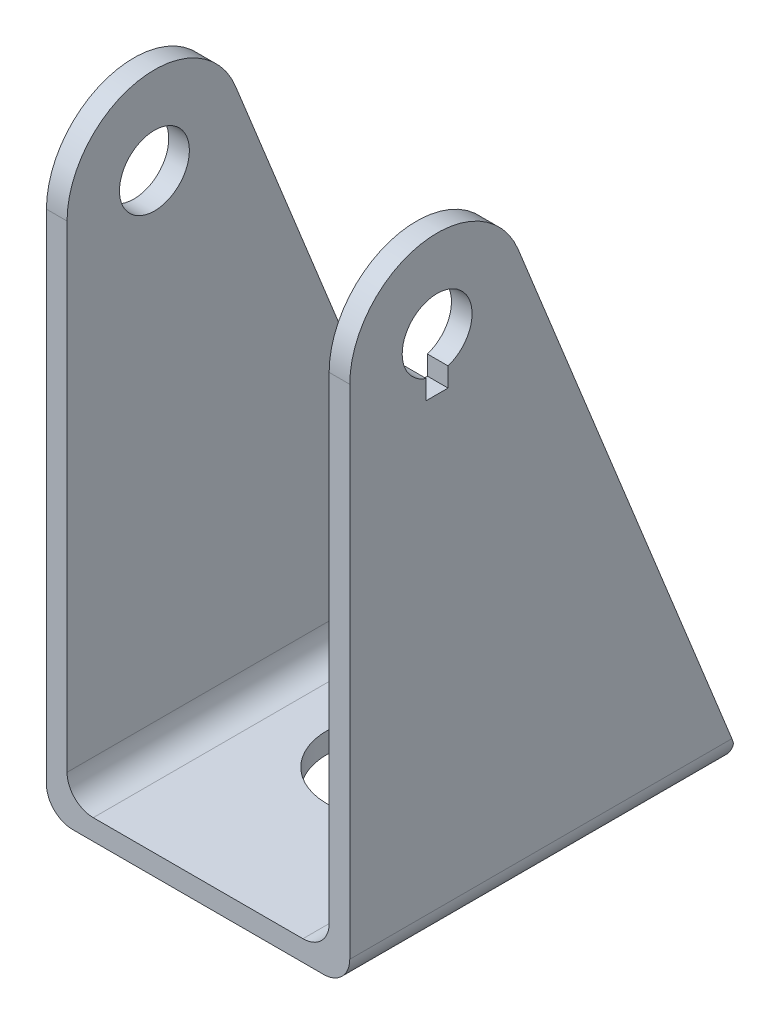
ISO-10303-21;
HEADER;
FILE_DESCRIPTION(('STEP AP214'),'2;1');
FILE_NAME('part.step','',(''),(''),'','','');
FILE_SCHEMA(('AUTOMOTIVE_DESIGN { 1 0 10303 214 1 1 1 1 }'));
ENDSEC;
DATA;
#1=APPLICATION_CONTEXT('core data for automotive mechanical design processes');
#2=APPLICATION_PROTOCOL_DEFINITION('international standard','automotive_design',2000,#1);
#3=PRODUCT_CONTEXT('',#1,'mechanical');
#4=PRODUCT('Part','Part','',(#3));
#5=PRODUCT_RELATED_PRODUCT_CATEGORY('part','',(#4));
#6=PRODUCT_DEFINITION_FORMATION('','',#4);
#7=PRODUCT_DEFINITION_CONTEXT('part definition',#1,'design');
#8=PRODUCT_DEFINITION('design','',#6,#7);
#9=PRODUCT_DEFINITION_SHAPE('','',#8);
#10=(LENGTH_UNIT() NAMED_UNIT(*) SI_UNIT(.MILLI.,.METRE.));
#11=(NAMED_UNIT(*) PLANE_ANGLE_UNIT() SI_UNIT($,.RADIAN.));
#12=(NAMED_UNIT(*) SI_UNIT($,.STERADIAN.) SOLID_ANGLE_UNIT());
#13=UNCERTAINTY_MEASURE_WITH_UNIT(LENGTH_MEASURE(1.E-05),#10,'distance_accuracy_value','');
#14=(GEOMETRIC_REPRESENTATION_CONTEXT(3) GLOBAL_UNCERTAINTY_ASSIGNED_CONTEXT((#13)) GLOBAL_UNIT_ASSIGNED_CONTEXT((#10,
#11,#12)) REPRESENTATION_CONTEXT('',''));
#15=CARTESIAN_POINT('',(0.,0.,0.));
#16=DIRECTION('',(0.,0.,1.));
#17=DIRECTION('',(1.,0.,0.));
#18=AXIS2_PLACEMENT_3D('',#15,#16,#17);
#19=CARTESIAN_POINT('',(34.72,60.,-10.));
#20=DIRECTION('',(1.,0.,0.));
#21=DIRECTION('',(0.,0.,-1.));
#22=AXIS2_PLACEMENT_3D('',#19,#20,#21);
#23=PLANE('',#22);
#24=DIRECTION('',(0.,-1.,0.));
#25=VECTOR('',#24,1.);
#26=CARTESIAN_POINT('',(34.72,60.,0.));
#27=LINE('',#26,#25);
#28=CARTESIAN_POINT('',(34.72,60.,0.));
#29=VERTEX_POINT('',#28);
#30=CARTESIAN_POINT('',(34.72,3.,0.));
#31=VERTEX_POINT('',#30);
#32=EDGE_CURVE('E187',#29,#31,#27,.T.);
#33=ORIENTED_EDGE('',*,*,#32,.T.);
#34=DIRECTION('',(0.,0.,-1.));
#35=VECTOR('',#34,1.);
#36=CARTESIAN_POINT('',(34.72,3.,-44.));
#37=LINE('',#36,#35);
#38=CARTESIAN_POINT('',(34.72,3.,-43.7421887290013));
#39=VERTEX_POINT('',#38);
#40=EDGE_CURVE('E212',#31,#39,#37,.T.);
#41=ORIENTED_EDGE('',*,*,#40,.T.);
#42=DIRECTION('',(0.,0.927568718346799,0.373652609711852));
#43=VECTOR('',#42,1.);
#44=CARTESIAN_POINT('',(34.72,2.36,-44.));
#45=LINE('',#44,#43);
#46=CARTESIAN_POINT('',(34.72,63.7365260971185,-19.275687183468));
#47=VERTEX_POINT('',#46);
#48=EDGE_CURVE('E191',#39,#47,#45,.T.);
#49=ORIENTED_EDGE('',*,*,#48,.T.);
#50=CARTESIAN_POINT('',(34.72,60.,-10.));
#51=DIRECTION('',(1.,0.,0.));
#52=DIRECTION('',(0.,0.,-1.));
#53=AXIS2_PLACEMENT_3D('',#50,#51,#52);
#54=CIRCLE('',#53,10.);
#55=EDGE_CURVE('E184',#47,#29,#54,.T.);
#56=ORIENTED_EDGE('',*,*,#55,.T.);
#57=EDGE_LOOP('',(#33,#41,#49,#56));
#58=FACE_BOUND('',#57,.T.);
#59=DIRECTION('',(0.,0.,-1.));
#60=VECTOR('',#59,1.);
#61=CARTESIAN_POINT('',(34.72,54.,0.));
#62=LINE('',#61,#60);
#63=CARTESIAN_POINT('',(34.72,54.,-8.75));
#64=VERTEX_POINT('',#63);
#65=CARTESIAN_POINT('',(34.72,54.,-11.25));
#66=VERTEX_POINT('',#65);
#67=EDGE_CURVE('E158',#64,#66,#62,.T.);
#68=ORIENTED_EDGE('',*,*,#67,.F.);
#69=DIRECTION('',(0.,-1.,0.));
#70=VECTOR('',#69,1.);
#71=CARTESIAN_POINT('',(34.72,0.,-8.75));
#72=LINE('',#71,#70);
#73=CARTESIAN_POINT('',(34.72,56.2003289616073,-8.75));
#74=VERTEX_POINT('',#73);
#75=EDGE_CURVE('E169',#74,#64,#72,.T.);
#76=ORIENTED_EDGE('',*,*,#75,.F.);
#77=CARTESIAN_POINT('',(34.72,60.,-10.));
#78=DIRECTION('',(1.,0.,0.));
#79=DIRECTION('',(0.,0.,-1.));
#80=AXIS2_PLACEMENT_3D('',#77,#78,#79);
#81=CIRCLE('',#80,4.);
#82=CARTESIAN_POINT('',(34.72,56.2003289616073,-11.25));
#83=VERTEX_POINT('',#82);
#84=EDGE_CURVE('E166',#83,#74,#81,.T.);
#85=ORIENTED_EDGE('',*,*,#84,.F.);
#86=DIRECTION('',(0.,-1.,0.));
#87=VECTOR('',#86,1.);
#88=CARTESIAN_POINT('',(34.72,0.,-11.25));
#89=LINE('',#88,#87);
#90=EDGE_CURVE('E152',#83,#66,#89,.T.);
#91=ORIENTED_EDGE('',*,*,#90,.T.);
#92=EDGE_LOOP('',(#68,#76,#85,#91));
#93=FACE_BOUND('',#92,.T.);
#94=ADVANCED_FACE('F32',(#58,#93),#23,.T.);
#95=CARTESIAN_POINT('',(34.72,60.,-10.));
#96=DIRECTION('',(-1.,0.,0.));
#97=DIRECTION('',(0.,0.,1.));
#98=AXIS2_PLACEMENT_3D('',#95,#96,#97);
#99=CYLINDRICAL_SURFACE('',#98,4.);
#100=ORIENTED_EDGE('',*,*,#84,.T.);
#101=DIRECTION('',(-1.,0.,0.));
#102=VECTOR('',#101,1.);
#103=CARTESIAN_POINT('',(34.72,56.2003289616073,-8.75));
#104=LINE('',#103,#102);
#105=CARTESIAN_POINT('',(32.36,56.2003289616073,-8.75));
#106=VERTEX_POINT('',#105);
#107=EDGE_CURVE('E273',#74,#106,#104,.T.);
#108=ORIENTED_EDGE('',*,*,#107,.T.);
#109=CARTESIAN_POINT('',(32.36,60.,-10.));
#110=DIRECTION('',(1.,0.,0.));
#111=DIRECTION('',(0.,1.,0.));
#112=AXIS2_PLACEMENT_3D('',#109,#110,#111);
#113=CIRCLE('',#112,4.);
#114=CARTESIAN_POINT('',(32.36,56.2003289616073,-11.25));
#115=VERTEX_POINT('',#114);
#116=EDGE_CURVE('E168',#115,#106,#113,.T.);
#117=ORIENTED_EDGE('',*,*,#116,.F.);
#118=DIRECTION('',(-1.,0.,0.));
#119=VECTOR('',#118,1.);
#120=CARTESIAN_POINT('',(34.72,56.2003289616073,-11.25));
#121=LINE('',#120,#119);
#122=EDGE_CURVE('E47',#83,#115,#121,.T.);
#123=ORIENTED_EDGE('',*,*,#122,.F.);
#124=EDGE_LOOP('',(#100,#108,#117,#123));
#125=FACE_BOUND('',#124,.T.);
#126=ADVANCED_FACE('F164',(#125),#99,.F.);
#127=CARTESIAN_POINT('',(32.36,70.,-44.));
#128=DIRECTION('',(1.,0.,0.));
#129=DIRECTION('',(0.,1.,0.));
#130=AXIS2_PLACEMENT_3D('',#127,#128,#129);
#131=PLANE('',#130);
#132=DIRECTION('',(0.,0.927568718346799,0.373652609711852));
#133=VECTOR('',#132,1.);
#134=CARTESIAN_POINT('',(32.36,2.36,-44.));
#135=LINE('',#134,#133);
#136=CARTESIAN_POINT('',(32.36,5.36,-42.7915096671938));
#137=VERTEX_POINT('',#136);
#138=CARTESIAN_POINT('',(32.36,63.7365260971185,-19.275687183468));
#139=VERTEX_POINT('',#138);
#140=EDGE_CURVE('E214',#137,#139,#135,.T.);
#141=ORIENTED_EDGE('',*,*,#140,.F.);
#142=DIRECTION('',(0.,0.,1.));
#143=VECTOR('',#142,1.);
#144=CARTESIAN_POINT('',(32.36,5.36,0.));
#145=LINE('',#144,#143);
#146=CARTESIAN_POINT('',(32.36,5.36,0.));
#147=VERTEX_POINT('',#146);
#148=EDGE_CURVE('E242',#137,#147,#145,.T.);
#149=ORIENTED_EDGE('',*,*,#148,.T.);
#150=DIRECTION('',(0.,1.,0.));
#151=VECTOR('',#150,1.);
#152=CARTESIAN_POINT('',(32.36,70.,0.));
#153=LINE('',#152,#151);
#154=CARTESIAN_POINT('',(32.36,60.,0.));
#155=VERTEX_POINT('',#154);
#156=EDGE_CURVE('E285',#147,#155,#153,.T.);
#157=ORIENTED_EDGE('',*,*,#156,.T.);
#158=CARTESIAN_POINT('',(32.36,60.,-10.));
#159=DIRECTION('',(1.,0.,0.));
#160=DIRECTION('',(0.,1.,0.));
#161=AXIS2_PLACEMENT_3D('',#158,#159,#160);
#162=CIRCLE('',#161,10.);
#163=EDGE_CURVE('E220',#139,#155,#162,.T.);
#164=ORIENTED_EDGE('',*,*,#163,.F.);
#165=EDGE_LOOP('',(#141,#149,#157,#164));
#166=FACE_BOUND('',#165,.T.);
#167=DIRECTION('',(0.,-1.,0.));
#168=VECTOR('',#167,1.);
#169=CARTESIAN_POINT('',(32.36,0.,-8.75));
#170=LINE('',#169,#168);
#171=CARTESIAN_POINT('',(32.36,54.,-8.75));
#172=VERTEX_POINT('',#171);
#173=EDGE_CURVE('E159',#106,#172,#170,.T.);
#174=ORIENTED_EDGE('',*,*,#173,.T.);
#175=DIRECTION('',(0.,0.,-1.));
#176=VECTOR('',#175,1.);
#177=CARTESIAN_POINT('',(32.36,54.,0.));
#178=LINE('',#177,#176);
#179=CARTESIAN_POINT('',(32.36,54.,-11.25));
#180=VERTEX_POINT('',#179);
#181=EDGE_CURVE('E295',#172,#180,#178,.T.);
#182=ORIENTED_EDGE('',*,*,#181,.T.);
#183=DIRECTION('',(0.,-1.,0.));
#184=VECTOR('',#183,1.);
#185=CARTESIAN_POINT('',(32.36,0.,-11.25));
#186=LINE('',#185,#184);
#187=EDGE_CURVE('E298',#115,#180,#186,.T.);
#188=ORIENTED_EDGE('',*,*,#187,.F.);
#189=ORIENTED_EDGE('',*,*,#116,.T.);
#190=EDGE_LOOP('',(#174,#182,#188,#189));
#191=FACE_BOUND('',#190,.T.);
#192=ADVANCED_FACE('F336',(#166,#191),#131,.F.);
#193=CARTESIAN_POINT('',(34.72,60.,-10.));
#194=DIRECTION('',(-1.,0.,0.));
#195=DIRECTION('',(0.,0.,1.));
#196=AXIS2_PLACEMENT_3D('',#193,#194,#195);
#197=CYLINDRICAL_SURFACE('',#196,10.);
#198=DIRECTION('',(-1.,0.,0.));
#199=VECTOR('',#198,1.);
#200=CARTESIAN_POINT('',(34.72,60.,0.));
#201=LINE('',#200,#199);
#202=CARTESIAN_POINT('',(2.35999999999999,60.,0.));
#203=VERTEX_POINT('',#202);
#204=CARTESIAN_POINT('',(0.,60.,0.));
#205=VERTEX_POINT('',#204);
#206=EDGE_CURVE('E208',#203,#205,#201,.T.);
#207=ORIENTED_EDGE('',*,*,#206,.F.);
#208=CARTESIAN_POINT('',(2.35999999999999,60.,-10.));
#209=DIRECTION('',(-1.,0.,0.));
#210=DIRECTION('',(0.,-1.,0.));
#211=AXIS2_PLACEMENT_3D('',#208,#209,#210);
#212=CIRCLE('',#211,10.);
#213=CARTESIAN_POINT('',(2.35999999999999,63.7365260971185,-19.275687183468));
#214=VERTEX_POINT('',#213);
#215=EDGE_CURVE('E179',#203,#214,#212,.T.);
#216=ORIENTED_EDGE('',*,*,#215,.T.);
#217=DIRECTION('',(-1.,0.,0.));
#218=VECTOR('',#217,1.);
#219=CARTESIAN_POINT('',(34.72,63.7365260971185,-19.275687183468));
#220=LINE('',#219,#218);
#221=CARTESIAN_POINT('',(0.,63.7365260971185,-19.275687183468));
#222=VERTEX_POINT('',#221);
#223=EDGE_CURVE('E192',#214,#222,#220,.T.);
#224=ORIENTED_EDGE('',*,*,#223,.T.);
#225=CARTESIAN_POINT('',(0.,60.,-10.));
#226=DIRECTION('',(1.,0.,0.));
#227=DIRECTION('',(0.,0.,-1.));
#228=AXIS2_PLACEMENT_3D('',#225,#226,#227);
#229=CIRCLE('',#228,10.);
#230=EDGE_CURVE('E172',#222,#205,#229,.T.);
#231=ORIENTED_EDGE('',*,*,#230,.T.);
#232=EDGE_LOOP('',(#207,#216,#224,#231));
#233=FACE_BOUND('',#232,.T.);
#234=ADVANCED_FACE('F363',(#233),#197,.T.);
#235=CARTESIAN_POINT('',(34.72,2.36,-44.));
#236=DIRECTION('',(0.,-0.373652609711852,0.927568718346799));
#237=DIRECTION('',(0.,-0.927568718346799,-0.373652609711852));
#238=AXIS2_PLACEMENT_3D('',#235,#236,#237);
#239=PLANE('',#238);
#240=DIRECTION('',(-1.,0.,0.));
#241=VECTOR('',#240,1.);
#242=CARTESIAN_POINT('',(34.72,2.36,-44.));
#243=LINE('',#242,#241);
#244=CARTESIAN_POINT('',(5.36,2.36,-44.));
#245=VERTEX_POINT('',#244);
#246=CARTESIAN_POINT('',(0.0690615837244252,2.36,-44.));
#247=VERTEX_POINT('',#246);
#248=EDGE_CURVE('E55',#245,#247,#243,.T.);
#249=ORIENTED_EDGE('',*,*,#248,.T.);
#250=CARTESIAN_POINT('',(3.,3.,-43.7421887290013));
#251=DIRECTION('',(0.,-0.373652609711852,0.927568718346799));
#252=DIRECTION('',(0.,-0.927568718346799,-0.373652609711852));
#253=AXIS2_PLACEMENT_3D('',#250,#251,#252);
#254=ELLIPSE('',#253,3.23426172170498,3.);
#255=CARTESIAN_POINT('',(0.,3.,-43.7421887290013));
#256=VERTEX_POINT('',#255);
#257=EDGE_CURVE('E238',#247,#256,#254,.F.);
#258=ORIENTED_EDGE('',*,*,#257,.T.);
#259=DIRECTION('',(0.,0.927568718346799,0.373652609711852));
#260=VECTOR('',#259,1.);
#261=CARTESIAN_POINT('',(0.,2.36,-44.));
#262=LINE('',#261,#260);
#263=EDGE_CURVE('E188',#256,#222,#262,.T.);
#264=ORIENTED_EDGE('',*,*,#263,.T.);
#265=ORIENTED_EDGE('',*,*,#223,.F.);
#266=DIRECTION('',(0.,-0.927568718346799,-0.373652609711852));
#267=VECTOR('',#266,1.);
#268=CARTESIAN_POINT('',(2.36,2.36,-44.));
#269=LINE('',#268,#267);
#270=CARTESIAN_POINT('',(2.36,5.36,-42.7915096671938));
#271=VERTEX_POINT('',#270);
#272=EDGE_CURVE('E219',#214,#271,#269,.T.);
#273=ORIENTED_EDGE('',*,*,#272,.T.);
#274=CARTESIAN_POINT('',(5.36,5.36,-42.7915096671938));
#275=DIRECTION('',(0.,-0.373652609711852,0.927568718346799));
#276=DIRECTION('',(0.,-0.927568718346799,-0.373652609711852));
#277=AXIS2_PLACEMENT_3D('',#274,#275,#276);
#278=ELLIPSE('',#277,3.23426172170498,3.);
#279=EDGE_CURVE('E11',#271,#245,#278,.T.);
#280=ORIENTED_EDGE('',*,*,#279,.T.);
#281=EDGE_LOOP('',(#249,#258,#264,#265,#273,#280));
#282=FACE_BOUND('',#281,.T.);
#283=ADVANCED_FACE('F277',(#282),#239,.F.);
#284=CARTESIAN_POINT('',(2.35999999999999,60.,-10.));
#285=DIRECTION('',(-1.,0.,0.));
#286=DIRECTION('',(0.,-1.,0.));
#287=AXIS2_PLACEMENT_3D('',#284,#285,#286);
#288=CIRCLE('',#287,4.);
#289=CARTESIAN_POINT('',(2.35999999999999,56.,-10.));
#290=VERTEX_POINT('',#289);
#291=EDGE_CURVE('E216',#290,#290,#288,.T.);
#292=ORIENTED_EDGE('',*,*,#291,.F.);
#293=EDGE_LOOP('',(#292));
#294=FACE_BOUND('',#293,.T.);
#295=CARTESIAN_POINT('',(0.,60.,-10.));
#296=DIRECTION('',(1.,0.,0.));
#297=DIRECTION('',(0.,0.,-1.));
#298=AXIS2_PLACEMENT_3D('',#295,#296,#297);
#299=CIRCLE('',#298,4.);
#300=CARTESIAN_POINT('',(0.,60.,-14.));
#301=VERTEX_POINT('',#300);
#302=EDGE_CURVE('E173',#301,#301,#299,.T.);
#303=ORIENTED_EDGE('',*,*,#302,.F.);
#304=EDGE_LOOP('',(#303));
#305=FACE_BOUND('',#304,.T.);
#306=ADVANCED_FACE('F370',(#294,#305),#99,.F.);
#307=CARTESIAN_POINT('',(0.,60.,-10.));
#308=DIRECTION('',(1.,0.,0.));
#309=DIRECTION('',(0.,0.,-1.));
#310=AXIS2_PLACEMENT_3D('',#307,#308,#309);
#311=PLANE('',#310);
#312=ORIENTED_EDGE('',*,*,#263,.F.);
#313=DIRECTION('',(0.,0.,-1.));
#314=VECTOR('',#313,1.);
#315=CARTESIAN_POINT('',(0.,3.,-10.));
#316=LINE('',#315,#314);
#317=CARTESIAN_POINT('',(0.,3.,0.));
#318=VERTEX_POINT('',#317);
#319=EDGE_CURVE('E240',#256,#318,#316,.F.);
#320=ORIENTED_EDGE('',*,*,#319,.T.);
#321=DIRECTION('',(0.,-1.,0.));
#322=VECTOR('',#321,1.);
#323=CARTESIAN_POINT('',(0.,60.,0.));
#324=LINE('',#323,#322);
#325=EDGE_CURVE('E176',#205,#318,#324,.T.);
#326=ORIENTED_EDGE('',*,*,#325,.F.);
#327=ORIENTED_EDGE('',*,*,#230,.F.);
#328=EDGE_LOOP('',(#312,#320,#326,#327));
#329=FACE_BOUND('',#328,.T.);
#330=ORIENTED_EDGE('',*,*,#302,.T.);
#331=EDGE_LOOP('',(#330));
#332=FACE_BOUND('',#331,.T.);
#333=ADVANCED_FACE('F359',(#329,#332),#311,.F.);
#334=ORIENTED_EDGE('',*,*,#163,.T.);
#335=EDGE_CURVE('E209',#29,#155,#201,.T.);
#336=ORIENTED_EDGE('',*,*,#335,.F.);
#337=ORIENTED_EDGE('',*,*,#55,.F.);
#338=EDGE_CURVE('E197',#47,#139,#220,.T.);
#339=ORIENTED_EDGE('',*,*,#338,.T.);
#340=EDGE_LOOP('',(#334,#336,#337,#339));
#341=FACE_BOUND('',#340,.T.);
#342=ADVANCED_FACE('F342',(#341),#197,.T.);
#343=CARTESIAN_POINT('',(34.72,60.,0.));
#344=DIRECTION('',(0.,0.,-1.));
#345=DIRECTION('',(0.,1.,0.));
#346=AXIS2_PLACEMENT_3D('',#343,#344,#345);
#347=PLANE('',#346);
#348=DIRECTION('',(-1.,0.,0.));
#349=VECTOR('',#348,1.);
#350=CARTESIAN_POINT('',(34.72,0.,0.));
#351=LINE('',#350,#349);
#352=CARTESIAN_POINT('',(31.72,0.,0.));
#353=VERTEX_POINT('',#352);
#354=CARTESIAN_POINT('',(3.,0.,0.));
#355=VERTEX_POINT('',#354);
#356=EDGE_CURVE('E205',#353,#355,#351,.T.);
#357=ORIENTED_EDGE('',*,*,#356,.F.);
#358=CARTESIAN_POINT('',(31.72,3.,0.));
#359=DIRECTION('',(0.,0.,-1.));
#360=DIRECTION('',(0.,1.,0.));
#361=AXIS2_PLACEMENT_3D('',#358,#359,#360);
#362=CIRCLE('',#361,3.);
#363=EDGE_CURVE('E236',#353,#31,#362,.F.);
#364=ORIENTED_EDGE('',*,*,#363,.T.);
#365=ORIENTED_EDGE('',*,*,#32,.F.);
#366=ORIENTED_EDGE('',*,*,#335,.T.);
#367=ORIENTED_EDGE('',*,*,#156,.F.);
#368=CARTESIAN_POINT('',(29.36,5.36,0.));
#369=DIRECTION('',(0.,0.,-1.));
#370=DIRECTION('',(0.,1.,0.));
#371=AXIS2_PLACEMENT_3D('',#368,#369,#370);
#372=CIRCLE('',#371,3.);
#373=CARTESIAN_POINT('',(29.36,2.36,0.));
#374=VERTEX_POINT('',#373);
#375=EDGE_CURVE('E253',#147,#374,#372,.T.);
#376=ORIENTED_EDGE('',*,*,#375,.T.);
#377=DIRECTION('',(1.,0.,0.));
#378=VECTOR('',#377,1.);
#379=CARTESIAN_POINT('',(2.36,2.36,0.));
#380=LINE('',#379,#378);
#381=CARTESIAN_POINT('',(5.36,2.36,0.));
#382=VERTEX_POINT('',#381);
#383=EDGE_CURVE('E265',#382,#374,#380,.T.);
#384=ORIENTED_EDGE('',*,*,#383,.F.);
#385=CARTESIAN_POINT('',(5.36,5.36,0.));
#386=DIRECTION('',(0.,0.,-1.));
#387=DIRECTION('',(0.,1.,0.));
#388=AXIS2_PLACEMENT_3D('',#385,#386,#387);
#389=CIRCLE('',#388,3.);
#390=CARTESIAN_POINT('',(2.36,5.36,0.));
#391=VERTEX_POINT('',#390);
#392=EDGE_CURVE('E40',#382,#391,#389,.T.);
#393=ORIENTED_EDGE('',*,*,#392,.T.);
#394=DIRECTION('',(0.,-1.,0.));
#395=VECTOR('',#394,1.);
#396=CARTESIAN_POINT('',(2.35999999999999,70.,0.));
#397=LINE('',#396,#395);
#398=EDGE_CURVE('E262',#203,#391,#397,.T.);
#399=ORIENTED_EDGE('',*,*,#398,.F.);
#400=ORIENTED_EDGE('',*,*,#206,.T.);
#401=ORIENTED_EDGE('',*,*,#325,.T.);
#402=CARTESIAN_POINT('',(3.,3.,0.));
#403=DIRECTION('',(0.,0.,-1.));
#404=DIRECTION('',(0.,1.,0.));
#405=AXIS2_PLACEMENT_3D('',#402,#403,#404);
#406=CIRCLE('',#405,3.);
#407=EDGE_CURVE('E234',#318,#355,#406,.F.);
#408=ORIENTED_EDGE('',*,*,#407,.T.);
#409=EDGE_LOOP('',(#357,#364,#365,#366,#367,#376,#384,#393,#399,#400,#401,#408));
#410=FACE_BOUND('',#409,.T.);
#411=ADVANCED_FACE('F261',(#410),#347,.F.);
#412=CARTESIAN_POINT('',(34.72,0.,0.));
#413=DIRECTION('',(0.,1.,0.));
#414=DIRECTION('',(0.,0.,1.));
#415=AXIS2_PLACEMENT_3D('',#412,#413,#414);
#416=PLANE('',#415);
#417=CARTESIAN_POINT('',(17.36,0.,-22.));
#418=DIRECTION('',(0.,1.,0.));
#419=DIRECTION('',(0.,0.,1.));
#420=AXIS2_PLACEMENT_3D('',#417,#418,#419);
#421=CIRCLE('',#420,7.25);
#422=CARTESIAN_POINT('',(17.36,0.,-14.75));
#423=VERTEX_POINT('',#422);
#424=EDGE_CURVE('E300',#423,#423,#421,.T.);
#425=ORIENTED_EDGE('',*,*,#424,.T.);
#426=EDGE_LOOP('',(#425));
#427=FACE_BOUND('',#426,.T.);
#428=DIRECTION('',(-1.,0.,0.));
#429=VECTOR('',#428,1.);
#430=CARTESIAN_POINT('',(34.72,0.,-44.));
#431=LINE('',#430,#429);
#432=CARTESIAN_POINT('',(31.72,0.,-44.));
#433=VERTEX_POINT('',#432);
#434=CARTESIAN_POINT('',(3.,0.,-44.));
#435=VERTEX_POINT('',#434);
#436=EDGE_CURVE('E202',#433,#435,#431,.T.);
#437=ORIENTED_EDGE('',*,*,#436,.F.);
#438=DIRECTION('',(0.,0.,-1.));
#439=VECTOR('',#438,1.);
#440=CARTESIAN_POINT('',(31.72,0.,0.));
#441=LINE('',#440,#439);
#442=EDGE_CURVE('E232',#433,#353,#441,.F.);
#443=ORIENTED_EDGE('',*,*,#442,.T.);
#444=ORIENTED_EDGE('',*,*,#356,.T.);
#445=DIRECTION('',(0.,0.,-1.));
#446=VECTOR('',#445,1.);
#447=CARTESIAN_POINT('',(3.,0.,0.));
#448=LINE('',#447,#446);
#449=EDGE_CURVE('E229',#355,#435,#448,.T.);
#450=ORIENTED_EDGE('',*,*,#449,.T.);
#451=EDGE_LOOP('',(#437,#443,#444,#450));
#452=FACE_BOUND('',#451,.T.);
#453=ADVANCED_FACE('F309',(#427,#452),#416,.F.);
#454=CARTESIAN_POINT('',(34.72,0.,-44.));
#455=DIRECTION('',(0.,0.,1.));
#456=DIRECTION('',(1.,0.,0.));
#457=AXIS2_PLACEMENT_3D('',#454,#455,#456);
#458=PLANE('',#457);
#459=CARTESIAN_POINT('',(34.6509384162756,2.36,-44.));
#460=VERTEX_POINT('',#459);
#461=CARTESIAN_POINT('',(29.36,2.36,-44.));
#462=VERTEX_POINT('',#461);
#463=EDGE_CURVE('E200',#460,#462,#243,.T.);
#464=ORIENTED_EDGE('',*,*,#463,.F.);
#465=CARTESIAN_POINT('',(31.72,3.,-44.));
#466=DIRECTION('',(0.,0.,1.));
#467=DIRECTION('',(1.,0.,0.));
#468=AXIS2_PLACEMENT_3D('',#465,#466,#467);
#469=CIRCLE('',#468,3.);
#470=EDGE_CURVE('E227',#460,#433,#469,.F.);
#471=ORIENTED_EDGE('',*,*,#470,.T.);
#472=ORIENTED_EDGE('',*,*,#436,.T.);
#473=CARTESIAN_POINT('',(3.,3.,-44.));
#474=DIRECTION('',(0.,0.,1.));
#475=DIRECTION('',(1.,0.,0.));
#476=AXIS2_PLACEMENT_3D('',#473,#474,#475);
#477=CIRCLE('',#476,3.);
#478=EDGE_CURVE('E225',#435,#247,#477,.F.);
#479=ORIENTED_EDGE('',*,*,#478,.T.);
#480=ORIENTED_EDGE('',*,*,#248,.F.);
#481=DIRECTION('',(1.,0.,0.));
#482=VECTOR('',#481,1.);
#483=CARTESIAN_POINT('',(2.36,2.36,-44.));
#484=LINE('',#483,#482);
#485=EDGE_CURVE('E215',#245,#462,#484,.T.);
#486=ORIENTED_EDGE('',*,*,#485,.T.);
#487=EDGE_LOOP('',(#464,#471,#472,#479,#480,#486));
#488=FACE_BOUND('',#487,.T.);
#489=ADVANCED_FACE('F350',(#488),#458,.F.);
#490=ORIENTED_EDGE('',*,*,#48,.F.);
#491=CARTESIAN_POINT('',(31.72,3.,-43.7421887290013));
#492=DIRECTION('',(0.,-0.373652609711852,0.927568718346799));
#493=DIRECTION('',(0.,0.927568718346799,0.373652609711852));
#494=AXIS2_PLACEMENT_3D('',#491,#492,#493);
#495=ELLIPSE('',#494,3.23426172170498,3.);
#496=EDGE_CURVE('E223',#39,#460,#495,.F.);
#497=ORIENTED_EDGE('',*,*,#496,.T.);
#498=ORIENTED_EDGE('',*,*,#463,.T.);
#499=CARTESIAN_POINT('',(29.36,5.36,-42.7915096671938));
#500=DIRECTION('',(0.,-0.373652609711852,0.927568718346799));
#501=DIRECTION('',(0.,-0.927568718346799,-0.373652609711852));
#502=AXIS2_PLACEMENT_3D('',#499,#500,#501);
#503=ELLIPSE('',#502,3.23426172170498,3.);
#504=EDGE_CURVE('E255',#462,#137,#503,.T.);
#505=ORIENTED_EDGE('',*,*,#504,.T.);
#506=ORIENTED_EDGE('',*,*,#140,.T.);
#507=ORIENTED_EDGE('',*,*,#338,.F.);
#508=EDGE_LOOP('',(#490,#497,#498,#505,#506,#507));
#509=FACE_BOUND('',#508,.T.);
#510=ADVANCED_FACE('F331',(#509),#239,.F.);
#511=CARTESIAN_POINT('',(2.35999999999999,70.,-44.));
#512=DIRECTION('',(-1.,0.,0.));
#513=DIRECTION('',(0.,-1.,0.));
#514=AXIS2_PLACEMENT_3D('',#511,#512,#513);
#515=PLANE('',#514);
#516=ORIENTED_EDGE('',*,*,#291,.T.);
#517=EDGE_LOOP('',(#516));
#518=FACE_BOUND('',#517,.T.);
#519=ORIENTED_EDGE('',*,*,#398,.T.);
#520=DIRECTION('',(0.,0.,1.));
#521=VECTOR('',#520,1.);
#522=CARTESIAN_POINT('',(2.36,5.36,-44.));
#523=LINE('',#522,#521);
#524=EDGE_CURVE('E251',#391,#271,#523,.F.);
#525=ORIENTED_EDGE('',*,*,#524,.T.);
#526=ORIENTED_EDGE('',*,*,#272,.F.);
#527=ORIENTED_EDGE('',*,*,#215,.F.);
#528=EDGE_LOOP('',(#519,#525,#526,#527));
#529=FACE_BOUND('',#528,.T.);
#530=ADVANCED_FACE('F270',(#518,#529),#515,.F.);
#531=CARTESIAN_POINT('',(2.36,2.36,-44.));
#532=DIRECTION('',(0.,-1.,0.));
#533=DIRECTION('',(0.,0.,-1.));
#534=AXIS2_PLACEMENT_3D('',#531,#532,#533);
#535=PLANE('',#534);
#536=CARTESIAN_POINT('',(17.36,2.36,-22.));
#537=DIRECTION('',(0.,1.,0.));
#538=DIRECTION('',(0.,0.,1.));
#539=AXIS2_PLACEMENT_3D('',#536,#537,#538);
#540=CIRCLE('',#539,7.25);
#541=CARTESIAN_POINT('',(17.36,2.36,-14.75));
#542=VERTEX_POINT('',#541);
#543=EDGE_CURVE('E303',#542,#542,#540,.T.);
#544=ORIENTED_EDGE('',*,*,#543,.F.);
#545=EDGE_LOOP('',(#544));
#546=FACE_BOUND('',#545,.T.);
#547=ORIENTED_EDGE('',*,*,#383,.T.);
#548=DIRECTION('',(0.,0.,1.));
#549=VECTOR('',#548,1.);
#550=CARTESIAN_POINT('',(29.36,2.36,-44.));
#551=LINE('',#550,#549);
#552=EDGE_CURVE('E248',#374,#462,#551,.F.);
#553=ORIENTED_EDGE('',*,*,#552,.T.);
#554=ORIENTED_EDGE('',*,*,#485,.F.);
#555=DIRECTION('',(0.,0.,1.));
#556=VECTOR('',#555,1.);
#557=CARTESIAN_POINT('',(5.36,2.36,0.));
#558=LINE('',#557,#556);
#559=EDGE_CURVE('E245',#245,#382,#558,.T.);
#560=ORIENTED_EDGE('',*,*,#559,.T.);
#561=EDGE_LOOP('',(#547,#553,#554,#560));
#562=FACE_BOUND('',#561,.T.);
#563=ADVANCED_FACE('F318',(#546,#562),#535,.F.);
#564=CARTESIAN_POINT('',(31.72,3.,-10.));
#565=DIRECTION('',(0.,0.,1.));
#566=DIRECTION('',(1.,0.,0.));
#567=AXIS2_PLACEMENT_3D('',#564,#565,#566);
#568=CYLINDRICAL_SURFACE('',#567,3.);
#569=ORIENTED_EDGE('',*,*,#363,.F.);
#570=ORIENTED_EDGE('',*,*,#442,.F.);
#571=ORIENTED_EDGE('',*,*,#470,.F.);
#572=ORIENTED_EDGE('',*,*,#496,.F.);
#573=ORIENTED_EDGE('',*,*,#40,.F.);
#574=EDGE_LOOP('',(#569,#570,#571,#572,#573));
#575=FACE_BOUND('',#574,.T.);
#576=ADVANCED_FACE('F321',(#575),#568,.T.);
#577=CARTESIAN_POINT('',(3.,3.,0.));
#578=DIRECTION('',(0.,0.,-1.));
#579=DIRECTION('',(-1.,0.,0.));
#580=AXIS2_PLACEMENT_3D('',#577,#578,#579);
#581=CYLINDRICAL_SURFACE('',#580,3.);
#582=ORIENTED_EDGE('',*,*,#407,.F.);
#583=ORIENTED_EDGE('',*,*,#319,.F.);
#584=ORIENTED_EDGE('',*,*,#257,.F.);
#585=ORIENTED_EDGE('',*,*,#478,.F.);
#586=ORIENTED_EDGE('',*,*,#449,.F.);
#587=EDGE_LOOP('',(#582,#583,#584,#585,#586));
#588=FACE_BOUND('',#587,.T.);
#589=ADVANCED_FACE('F354',(#588),#581,.T.);
#590=CARTESIAN_POINT('',(29.36,5.36,-44.));
#591=DIRECTION('',(0.,0.,-1.));
#592=DIRECTION('',(-1.,0.,0.));
#593=AXIS2_PLACEMENT_3D('',#590,#591,#592);
#594=CYLINDRICAL_SURFACE('',#593,3.);
#595=ORIENTED_EDGE('',*,*,#504,.F.);
#596=ORIENTED_EDGE('',*,*,#552,.F.);
#597=ORIENTED_EDGE('',*,*,#375,.F.);
#598=ORIENTED_EDGE('',*,*,#148,.F.);
#599=EDGE_LOOP('',(#595,#596,#597,#598));
#600=FACE_BOUND('',#599,.T.);
#601=ADVANCED_FACE('F326',(#600),#594,.F.);
#602=CARTESIAN_POINT('',(5.36,5.36,-44.));
#603=DIRECTION('',(0.,0.,-1.));
#604=DIRECTION('',(-1.,0.,0.));
#605=AXIS2_PLACEMENT_3D('',#602,#603,#604);
#606=CYLINDRICAL_SURFACE('',#605,3.);
#607=ORIENTED_EDGE('',*,*,#279,.F.);
#608=ORIENTED_EDGE('',*,*,#524,.F.);
#609=ORIENTED_EDGE('',*,*,#392,.F.);
#610=ORIENTED_EDGE('',*,*,#559,.F.);
#611=EDGE_LOOP('',(#607,#608,#609,#610));
#612=FACE_BOUND('',#611,.T.);
#613=ADVANCED_FACE('F34',(#612),#606,.F.);
#614=CARTESIAN_POINT('',(34.72,0.,-8.75));
#615=DIRECTION('',(0.,0.,-1.));
#616=DIRECTION('',(-1.,0.,0.));
#617=AXIS2_PLACEMENT_3D('',#614,#615,#616);
#618=PLANE('',#617);
#619=ORIENTED_EDGE('',*,*,#173,.F.);
#620=ORIENTED_EDGE('',*,*,#107,.F.);
#621=ORIENTED_EDGE('',*,*,#75,.T.);
#622=DIRECTION('',(-1.,0.,0.));
#623=VECTOR('',#622,1.);
#624=CARTESIAN_POINT('',(34.72,54.,-8.75));
#625=LINE('',#624,#623);
#626=EDGE_CURVE('E290',#64,#172,#625,.T.);
#627=ORIENTED_EDGE('',*,*,#626,.T.);
#628=EDGE_LOOP('',(#619,#620,#621,#627));
#629=FACE_BOUND('',#628,.T.);
#630=ADVANCED_FACE('F442',(#629),#618,.T.);
#631=CARTESIAN_POINT('',(34.72,54.,0.));
#632=DIRECTION('',(0.,1.,0.));
#633=DIRECTION('',(-1.,0.,0.));
#634=AXIS2_PLACEMENT_3D('',#631,#632,#633);
#635=PLANE('',#634);
#636=ORIENTED_EDGE('',*,*,#181,.F.);
#637=ORIENTED_EDGE('',*,*,#626,.F.);
#638=ORIENTED_EDGE('',*,*,#67,.T.);
#639=DIRECTION('',(-1.,0.,0.));
#640=VECTOR('',#639,1.);
#641=CARTESIAN_POINT('',(34.72,54.,-11.25));
#642=LINE('',#641,#640);
#643=EDGE_CURVE('E154',#66,#180,#642,.T.);
#644=ORIENTED_EDGE('',*,*,#643,.T.);
#645=EDGE_LOOP('',(#636,#637,#638,#644));
#646=FACE_BOUND('',#645,.T.);
#647=ADVANCED_FACE('F448',(#646),#635,.T.);
#648=CARTESIAN_POINT('',(34.72,0.,-11.25));
#649=DIRECTION('',(0.,0.,-1.));
#650=DIRECTION('',(-1.,0.,0.));
#651=AXIS2_PLACEMENT_3D('',#648,#649,#650);
#652=PLANE('',#651);
#653=ORIENTED_EDGE('',*,*,#187,.T.);
#654=ORIENTED_EDGE('',*,*,#643,.F.);
#655=ORIENTED_EDGE('',*,*,#90,.F.);
#656=ORIENTED_EDGE('',*,*,#122,.T.);
#657=EDGE_LOOP('',(#653,#654,#655,#656));
#658=FACE_BOUND('',#657,.T.);
#659=ADVANCED_FACE('F153',(#658),#652,.F.);
#660=CARTESIAN_POINT('',(17.36,0.,-22.));
#661=DIRECTION('',(0.,1.,0.));
#662=DIRECTION('',(0.,0.,1.));
#663=AXIS2_PLACEMENT_3D('',#660,#661,#662);
#664=CYLINDRICAL_SURFACE('',#663,7.25);
#665=ORIENTED_EDGE('',*,*,#424,.F.);
#666=EDGE_LOOP('',(#665));
#667=FACE_BOUND('',#666,.T.);
#668=ORIENTED_EDGE('',*,*,#543,.T.);
#669=EDGE_LOOP('',(#668));
#670=FACE_BOUND('',#669,.T.);
#671=ADVANCED_FACE('F312',(#667,#670),#664,.F.);
#672=CLOSED_SHELL('',(#94,#126,#192,#234,#283,#306,#333,#342,#411,#453,#489,#510,#530,#563,#576,
#589,#601,#613,#630,#647,#659,#671));
#673=MANIFOLD_SOLID_BREP('B2',#672);
#674=ADVANCED_BREP_SHAPE_REPRESENTATION('',(#18,#673),#14);
#675=SHAPE_DEFINITION_REPRESENTATION(#9,#674);
ENDSEC;
END-ISO-10303-21;
